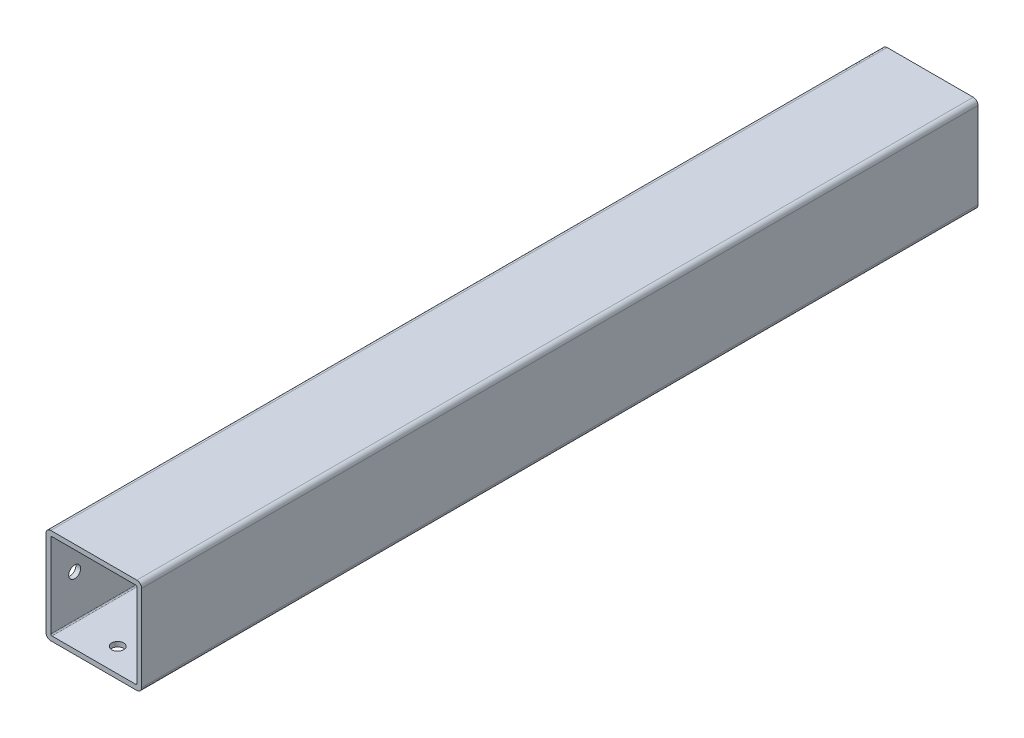
ISO-10303-21;
HEADER;
FILE_DESCRIPTION(('STEP AP214'),'2;1');
FILE_NAME('part.step','',(''),(''),'','','');
FILE_SCHEMA(('AUTOMOTIVE_DESIGN { 1 0 10303 214 1 1 1 1 }'));
ENDSEC;
DATA;
#1=APPLICATION_CONTEXT('core data for automotive mechanical design processes');
#2=APPLICATION_PROTOCOL_DEFINITION('international standard','automotive_design',2000,#1);
#3=PRODUCT_CONTEXT('',#1,'mechanical');
#4=PRODUCT('Part','Part','',(#3));
#5=PRODUCT_RELATED_PRODUCT_CATEGORY('part','',(#4));
#6=PRODUCT_DEFINITION_FORMATION('','',#4);
#7=PRODUCT_DEFINITION_CONTEXT('part definition',#1,'design');
#8=PRODUCT_DEFINITION('design','',#6,#7);
#9=PRODUCT_DEFINITION_SHAPE('','',#8);
#10=(LENGTH_UNIT() NAMED_UNIT(*) SI_UNIT(.MILLI.,.METRE.));
#11=(NAMED_UNIT(*) PLANE_ANGLE_UNIT() SI_UNIT($,.RADIAN.));
#12=(NAMED_UNIT(*) SI_UNIT($,.STERADIAN.) SOLID_ANGLE_UNIT());
#13=UNCERTAINTY_MEASURE_WITH_UNIT(LENGTH_MEASURE(1.E-05),#10,'distance_accuracy_value','');
#14=(GEOMETRIC_REPRESENTATION_CONTEXT(3) GLOBAL_UNCERTAINTY_ASSIGNED_CONTEXT((#13)) GLOBAL_UNIT_ASSIGNED_CONTEXT((#10,
#11,#12)) REPRESENTATION_CONTEXT('',''));
#15=CARTESIAN_POINT('',(0.,0.,0.));
#16=DIRECTION('',(0.,0.,1.));
#17=DIRECTION('',(1.,0.,0.));
#18=AXIS2_PLACEMENT_3D('',#15,#16,#17);
#19=CARTESIAN_POINT('',(0.,0.,350.));
#20=DIRECTION('',(0.,0.,1.));
#21=DIRECTION('',(1.,0.,0.));
#22=AXIS2_PLACEMENT_3D('',#19,#20,#21);
#23=PLANE('',#22);
#24=DIRECTION('',(1.,0.,0.));
#25=VECTOR('',#24,1.);
#26=CARTESIAN_POINT('',(-20.,-20.,350.));
#27=LINE('',#26,#25);
#28=CARTESIAN_POINT('',(-18.,-20.,350.));
#29=VERTEX_POINT('',#28);
#30=CARTESIAN_POINT('',(18.,-20.,350.));
#31=VERTEX_POINT('',#30);
#32=EDGE_CURVE('E209',#29,#31,#27,.T.);
#33=ORIENTED_EDGE('',*,*,#32,.T.);
#34=CARTESIAN_POINT('',(18.,-18.,350.));
#35=DIRECTION('',(0.,0.,1.));
#36=DIRECTION('',(1.,0.,0.));
#37=AXIS2_PLACEMENT_3D('',#34,#35,#36);
#38=CIRCLE('',#37,2.);
#39=CARTESIAN_POINT('',(20.,-18.,350.));
#40=VERTEX_POINT('',#39);
#41=EDGE_CURVE('E294',#31,#40,#38,.T.);
#42=ORIENTED_EDGE('',*,*,#41,.T.);
#43=DIRECTION('',(0.,1.,0.));
#44=VECTOR('',#43,1.);
#45=CARTESIAN_POINT('',(20.,20.,350.));
#46=LINE('',#45,#44);
#47=CARTESIAN_POINT('',(20.,18.,350.));
#48=VERTEX_POINT('',#47);
#49=EDGE_CURVE('E361',#40,#48,#46,.T.);
#50=ORIENTED_EDGE('',*,*,#49,.T.);
#51=CARTESIAN_POINT('',(18.,18.,350.));
#52=DIRECTION('',(0.,0.,1.));
#53=DIRECTION('',(1.,0.,0.));
#54=AXIS2_PLACEMENT_3D('',#51,#52,#53);
#55=CIRCLE('',#54,2.);
#56=CARTESIAN_POINT('',(18.,20.,350.));
#57=VERTEX_POINT('',#56);
#58=EDGE_CURVE('E288',#48,#57,#55,.T.);
#59=ORIENTED_EDGE('',*,*,#58,.T.);
#60=DIRECTION('',(-1.,0.,0.));
#61=VECTOR('',#60,1.);
#62=CARTESIAN_POINT('',(-20.,20.,350.));
#63=LINE('',#62,#61);
#64=CARTESIAN_POINT('',(-18.,20.,350.));
#65=VERTEX_POINT('',#64);
#66=EDGE_CURVE('E365',#57,#65,#63,.T.);
#67=ORIENTED_EDGE('',*,*,#66,.T.);
#68=CARTESIAN_POINT('',(-18.,18.,350.));
#69=DIRECTION('',(0.,0.,1.));
#70=DIRECTION('',(1.,0.,0.));
#71=AXIS2_PLACEMENT_3D('',#68,#69,#70);
#72=CIRCLE('',#71,2.);
#73=CARTESIAN_POINT('',(-20.,18.,350.));
#74=VERTEX_POINT('',#73);
#75=EDGE_CURVE('E87',#65,#74,#72,.T.);
#76=ORIENTED_EDGE('',*,*,#75,.T.);
#77=DIRECTION('',(0.,-1.,0.));
#78=VECTOR('',#77,1.);
#79=CARTESIAN_POINT('',(-20.,20.,350.));
#80=LINE('',#79,#78);
#81=CARTESIAN_POINT('',(-20.,-18.,350.));
#82=VERTEX_POINT('',#81);
#83=EDGE_CURVE('E218',#74,#82,#80,.T.);
#84=ORIENTED_EDGE('',*,*,#83,.T.);
#85=CARTESIAN_POINT('',(-18.,-18.,350.));
#86=DIRECTION('',(0.,0.,1.));
#87=DIRECTION('',(1.,0.,0.));
#88=AXIS2_PLACEMENT_3D('',#85,#86,#87);
#89=CIRCLE('',#88,2.);
#90=EDGE_CURVE('E291',#82,#29,#89,.T.);
#91=ORIENTED_EDGE('',*,*,#90,.T.);
#92=EDGE_LOOP('',(#33,#42,#50,#59,#67,#76,#84,#91));
#93=FACE_BOUND('',#92,.T.);
#94=DIRECTION('',(-1.,0.,0.));
#95=VECTOR('',#94,1.);
#96=CARTESIAN_POINT('',(-20.,18.,350.));
#97=LINE('',#96,#95);
#98=CARTESIAN_POINT('',(17.5,18.,350.));
#99=VERTEX_POINT('',#98);
#100=CARTESIAN_POINT('',(-17.5,18.,350.));
#101=VERTEX_POINT('',#100);
#102=EDGE_CURVE('E342',#99,#101,#97,.T.);
#103=ORIENTED_EDGE('',*,*,#102,.F.);
#104=CARTESIAN_POINT('',(17.5,17.5,350.));
#105=DIRECTION('',(0.,0.,1.));
#106=DIRECTION('',(1.,0.,0.));
#107=AXIS2_PLACEMENT_3D('',#104,#105,#106);
#108=CIRCLE('',#107,0.5);
#109=CARTESIAN_POINT('',(18.,17.5,350.));
#110=VERTEX_POINT('',#109);
#111=EDGE_CURVE('E253',#99,#110,#108,.F.);
#112=ORIENTED_EDGE('',*,*,#111,.T.);
#113=DIRECTION('',(0.,1.,0.));
#114=VECTOR('',#113,1.);
#115=CARTESIAN_POINT('',(18.,20.,350.));
#116=LINE('',#115,#114);
#117=CARTESIAN_POINT('',(18.,-17.5,350.));
#118=VERTEX_POINT('',#117);
#119=EDGE_CURVE('E338',#118,#110,#116,.T.);
#120=ORIENTED_EDGE('',*,*,#119,.F.);
#121=CARTESIAN_POINT('',(17.5,-17.5,350.));
#122=DIRECTION('',(0.,0.,1.));
#123=DIRECTION('',(1.,0.,0.));
#124=AXIS2_PLACEMENT_3D('',#121,#122,#123);
#125=CIRCLE('',#124,0.5);
#126=CARTESIAN_POINT('',(17.5,-18.,350.));
#127=VERTEX_POINT('',#126);
#128=EDGE_CURVE('E259',#118,#127,#125,.F.);
#129=ORIENTED_EDGE('',*,*,#128,.T.);
#130=DIRECTION('',(1.,0.,0.));
#131=VECTOR('',#130,1.);
#132=CARTESIAN_POINT('',(-20.,-18.,350.));
#133=LINE('',#132,#131);
#134=CARTESIAN_POINT('',(-17.5,-18.,350.));
#135=VERTEX_POINT('',#134);
#136=EDGE_CURVE('E349',#135,#127,#133,.T.);
#137=ORIENTED_EDGE('',*,*,#136,.F.);
#138=CARTESIAN_POINT('',(-17.5,-17.5,350.));
#139=DIRECTION('',(0.,0.,1.));
#140=DIRECTION('',(1.,0.,0.));
#141=AXIS2_PLACEMENT_3D('',#138,#139,#140);
#142=CIRCLE('',#141,0.5);
#143=CARTESIAN_POINT('',(-18.,-17.5,350.));
#144=VERTEX_POINT('',#143);
#145=EDGE_CURVE('E193',#135,#144,#142,.F.);
#146=ORIENTED_EDGE('',*,*,#145,.T.);
#147=DIRECTION('',(0.,-1.,0.));
#148=VECTOR('',#147,1.);
#149=CARTESIAN_POINT('',(-18.,20.,350.));
#150=LINE('',#149,#148);
#151=CARTESIAN_POINT('',(-18.,17.5,350.));
#152=VERTEX_POINT('',#151);
#153=EDGE_CURVE('E346',#152,#144,#150,.T.);
#154=ORIENTED_EDGE('',*,*,#153,.F.);
#155=CARTESIAN_POINT('',(-17.5,17.5,350.));
#156=DIRECTION('',(0.,0.,1.));
#157=DIRECTION('',(1.,0.,0.));
#158=AXIS2_PLACEMENT_3D('',#155,#156,#157);
#159=CIRCLE('',#158,0.5);
#160=EDGE_CURVE('E192',#152,#101,#159,.F.);
#161=ORIENTED_EDGE('',*,*,#160,.T.);
#162=EDGE_LOOP('',(#103,#112,#120,#129,#137,#146,#154,#161));
#163=FACE_BOUND('',#162,.T.);
#164=ADVANCED_FACE('F62',(#93,#163),#23,.T.);
#165=CARTESIAN_POINT('',(0.,0.,0.));
#166=DIRECTION('',(0.,0.,1.));
#167=DIRECTION('',(1.,0.,0.));
#168=AXIS2_PLACEMENT_3D('',#165,#166,#167);
#169=PLANE('',#168);
#170=DIRECTION('',(0.,1.,0.));
#171=VECTOR('',#170,1.);
#172=CARTESIAN_POINT('',(20.,20.,0.));
#173=LINE('',#172,#171);
#174=CARTESIAN_POINT('',(20.,-18.,0.));
#175=VERTEX_POINT('',#174);
#176=CARTESIAN_POINT('',(20.,18.,0.));
#177=VERTEX_POINT('',#176);
#178=EDGE_CURVE('E353',#175,#177,#173,.T.);
#179=ORIENTED_EDGE('',*,*,#178,.F.);
#180=CARTESIAN_POINT('',(18.,-18.,0.));
#181=DIRECTION('',(0.,0.,1.));
#182=DIRECTION('',(1.,0.,0.));
#183=AXIS2_PLACEMENT_3D('',#180,#181,#182);
#184=CIRCLE('',#183,2.);
#185=CARTESIAN_POINT('',(18.,-20.,0.));
#186=VERTEX_POINT('',#185);
#187=EDGE_CURVE('E276',#175,#186,#184,.F.);
#188=ORIENTED_EDGE('',*,*,#187,.T.);
#189=DIRECTION('',(1.,0.,0.));
#190=VECTOR('',#189,1.);
#191=CARTESIAN_POINT('',(-20.,-20.,0.));
#192=LINE('',#191,#190);
#193=CARTESIAN_POINT('',(-18.,-20.,0.));
#194=VERTEX_POINT('',#193);
#195=EDGE_CURVE('E221',#194,#186,#192,.T.);
#196=ORIENTED_EDGE('',*,*,#195,.F.);
#197=CARTESIAN_POINT('',(-18.,-18.,0.));
#198=DIRECTION('',(0.,0.,1.));
#199=DIRECTION('',(1.,0.,0.));
#200=AXIS2_PLACEMENT_3D('',#197,#198,#199);
#201=CIRCLE('',#200,2.);
#202=CARTESIAN_POINT('',(-20.,-18.,0.));
#203=VERTEX_POINT('',#202);
#204=EDGE_CURVE('E273',#194,#203,#201,.F.);
#205=ORIENTED_EDGE('',*,*,#204,.T.);
#206=DIRECTION('',(0.,-1.,0.));
#207=VECTOR('',#206,1.);
#208=CARTESIAN_POINT('',(-20.,20.,0.));
#209=LINE('',#208,#207);
#210=CARTESIAN_POINT('',(-20.,18.,0.));
#211=VERTEX_POINT('',#210);
#212=EDGE_CURVE('E375',#211,#203,#209,.T.);
#213=ORIENTED_EDGE('',*,*,#212,.F.);
#214=CARTESIAN_POINT('',(-18.,18.,0.));
#215=DIRECTION('',(0.,0.,1.));
#216=DIRECTION('',(1.,0.,0.));
#217=AXIS2_PLACEMENT_3D('',#214,#215,#216);
#218=CIRCLE('',#217,2.);
#219=CARTESIAN_POINT('',(-18.,20.,0.));
#220=VERTEX_POINT('',#219);
#221=EDGE_CURVE('E267',#211,#220,#218,.F.);
#222=ORIENTED_EDGE('',*,*,#221,.T.);
#223=DIRECTION('',(-1.,0.,0.));
#224=VECTOR('',#223,1.);
#225=CARTESIAN_POINT('',(-20.,20.,0.));
#226=LINE('',#225,#224);
#227=CARTESIAN_POINT('',(18.,20.,0.));
#228=VERTEX_POINT('',#227);
#229=EDGE_CURVE('E372',#228,#220,#226,.T.);
#230=ORIENTED_EDGE('',*,*,#229,.F.);
#231=CARTESIAN_POINT('',(18.,18.,0.));
#232=DIRECTION('',(0.,0.,1.));
#233=DIRECTION('',(1.,0.,0.));
#234=AXIS2_PLACEMENT_3D('',#231,#232,#233);
#235=CIRCLE('',#234,2.);
#236=EDGE_CURVE('E270',#228,#177,#235,.F.);
#237=ORIENTED_EDGE('',*,*,#236,.T.);
#238=EDGE_LOOP('',(#179,#188,#196,#205,#213,#222,#230,#237));
#239=FACE_BOUND('',#238,.T.);
#240=DIRECTION('',(1.,0.,0.));
#241=VECTOR('',#240,1.);
#242=CARTESIAN_POINT('',(-20.,-18.,0.));
#243=LINE('',#242,#241);
#244=CARTESIAN_POINT('',(-17.5,-18.,0.));
#245=VERTEX_POINT('',#244);
#246=CARTESIAN_POINT('',(17.5,-18.,0.));
#247=VERTEX_POINT('',#246);
#248=EDGE_CURVE('E204',#245,#247,#243,.T.);
#249=ORIENTED_EDGE('',*,*,#248,.T.);
#250=CARTESIAN_POINT('',(17.5,-17.5,0.));
#251=DIRECTION('',(0.,0.,1.));
#252=DIRECTION('',(1.,0.,0.));
#253=AXIS2_PLACEMENT_3D('',#250,#251,#252);
#254=CIRCLE('',#253,0.5);
#255=CARTESIAN_POINT('',(18.,-17.5,0.));
#256=VERTEX_POINT('',#255);
#257=EDGE_CURVE('E256',#247,#256,#254,.T.);
#258=ORIENTED_EDGE('',*,*,#257,.T.);
#259=DIRECTION('',(0.,1.,0.));
#260=VECTOR('',#259,1.);
#261=CARTESIAN_POINT('',(18.,20.,0.));
#262=LINE('',#261,#260);
#263=CARTESIAN_POINT('',(18.,17.5,0.));
#264=VERTEX_POINT('',#263);
#265=EDGE_CURVE('E309',#256,#264,#262,.T.);
#266=ORIENTED_EDGE('',*,*,#265,.T.);
#267=CARTESIAN_POINT('',(17.5,17.5,0.));
#268=DIRECTION('',(0.,0.,1.));
#269=DIRECTION('',(1.,0.,0.));
#270=AXIS2_PLACEMENT_3D('',#267,#268,#269);
#271=CIRCLE('',#270,0.5);
#272=CARTESIAN_POINT('',(17.5,18.,0.));
#273=VERTEX_POINT('',#272);
#274=EDGE_CURVE('E250',#264,#273,#271,.T.);
#275=ORIENTED_EDGE('',*,*,#274,.T.);
#276=DIRECTION('',(-1.,0.,0.));
#277=VECTOR('',#276,1.);
#278=CARTESIAN_POINT('',(-20.,18.,0.));
#279=LINE('',#278,#277);
#280=CARTESIAN_POINT('',(-17.5,18.,0.));
#281=VERTEX_POINT('',#280);
#282=EDGE_CURVE('E186',#273,#281,#279,.T.);
#283=ORIENTED_EDGE('',*,*,#282,.T.);
#284=CARTESIAN_POINT('',(-17.5,17.5,0.));
#285=DIRECTION('',(0.,0.,1.));
#286=DIRECTION('',(1.,0.,0.));
#287=AXIS2_PLACEMENT_3D('',#284,#285,#286);
#288=CIRCLE('',#287,0.5);
#289=CARTESIAN_POINT('',(-18.,17.5,0.));
#290=VERTEX_POINT('',#289);
#291=EDGE_CURVE('E180',#281,#290,#288,.T.);
#292=ORIENTED_EDGE('',*,*,#291,.T.);
#293=DIRECTION('',(0.,-1.,0.));
#294=VECTOR('',#293,1.);
#295=CARTESIAN_POINT('',(-18.,20.,0.));
#296=LINE('',#295,#294);
#297=CARTESIAN_POINT('',(-18.,-17.5,0.));
#298=VERTEX_POINT('',#297);
#299=EDGE_CURVE('E184',#290,#298,#296,.T.);
#300=ORIENTED_EDGE('',*,*,#299,.T.);
#301=CARTESIAN_POINT('',(-17.5,-17.5,0.));
#302=DIRECTION('',(0.,0.,1.));
#303=DIRECTION('',(1.,0.,0.));
#304=AXIS2_PLACEMENT_3D('',#301,#302,#303);
#305=CIRCLE('',#304,0.5);
#306=EDGE_CURVE('E243',#298,#245,#305,.T.);
#307=ORIENTED_EDGE('',*,*,#306,.T.);
#308=EDGE_LOOP('',(#249,#258,#266,#275,#283,#292,#300,#307));
#309=FACE_BOUND('',#308,.T.);
#310=ADVANCED_FACE('F183',(#239,#309),#169,.F.);
#311=CARTESIAN_POINT('',(20.,20.,350.));
#312=DIRECTION('',(-1.,0.,0.));
#313=DIRECTION('',(0.,-1.,0.));
#314=AXIS2_PLACEMENT_3D('',#311,#312,#313);
#315=PLANE('',#314);
#316=ORIENTED_EDGE('',*,*,#49,.F.);
#317=DIRECTION('',(0.,0.,-1.));
#318=VECTOR('',#317,1.);
#319=CARTESIAN_POINT('',(20.,-18.,350.));
#320=LINE('',#319,#318);
#321=EDGE_CURVE('E264',#40,#175,#320,.T.);
#322=ORIENTED_EDGE('',*,*,#321,.T.);
#323=ORIENTED_EDGE('',*,*,#178,.T.);
#324=DIRECTION('',(0.,0.,-1.));
#325=VECTOR('',#324,1.);
#326=CARTESIAN_POINT('',(20.,18.,350.));
#327=LINE('',#326,#325);
#328=EDGE_CURVE('E261',#177,#48,#327,.F.);
#329=ORIENTED_EDGE('',*,*,#328,.T.);
#330=EDGE_LOOP('',(#316,#322,#323,#329));
#331=FACE_BOUND('',#330,.T.);
#332=ADVANCED_FACE('F395',(#331),#315,.F.);
#333=CARTESIAN_POINT('',(-20.,20.,350.));
#334=DIRECTION('',(0.,-1.,0.));
#335=DIRECTION('',(0.,0.,-1.));
#336=AXIS2_PLACEMENT_3D('',#333,#334,#335);
#337=PLANE('',#336);
#338=ORIENTED_EDGE('',*,*,#66,.F.);
#339=DIRECTION('',(0.,0.,-1.));
#340=VECTOR('',#339,1.);
#341=CARTESIAN_POINT('',(18.,20.,350.));
#342=LINE('',#341,#340);
#343=EDGE_CURVE('E12',#57,#228,#342,.T.);
#344=ORIENTED_EDGE('',*,*,#343,.T.);
#345=ORIENTED_EDGE('',*,*,#229,.T.);
#346=DIRECTION('',(0.,0.,-1.));
#347=VECTOR('',#346,1.);
#348=CARTESIAN_POINT('',(-18.,20.,350.));
#349=LINE('',#348,#347);
#350=EDGE_CURVE('E72',#220,#65,#349,.F.);
#351=ORIENTED_EDGE('',*,*,#350,.T.);
#352=EDGE_LOOP('',(#338,#344,#345,#351));
#353=FACE_BOUND('',#352,.T.);
#354=ADVANCED_FACE('F403',(#353),#337,.F.);
#355=CARTESIAN_POINT('',(-20.,20.,350.));
#356=DIRECTION('',(1.,0.,0.));
#357=DIRECTION('',(0.,1.,0.));
#358=AXIS2_PLACEMENT_3D('',#355,#356,#357);
#359=PLANE('',#358);
#360=CARTESIAN_POINT('',(-20.,0.,315.));
#361=DIRECTION('',(1.,0.,0.));
#362=DIRECTION('',(0.,0.,-1.));
#363=AXIS2_PLACEMENT_3D('',#360,#361,#362);
#364=CIRCLE('',#363,2.50000000000002);
#365=CARTESIAN_POINT('',(-20.,0.,312.5));
#366=VERTEX_POINT('',#365);
#367=EDGE_CURVE('E314',#366,#366,#364,.T.);
#368=ORIENTED_EDGE('',*,*,#367,.T.);
#369=EDGE_LOOP('',(#368));
#370=FACE_BOUND('',#369,.T.);
#371=CARTESIAN_POINT('',(-20.,0.,340.));
#372=DIRECTION('',(1.,0.,0.));
#373=DIRECTION('',(0.,0.,-1.));
#374=AXIS2_PLACEMENT_3D('',#371,#372,#373);
#375=CIRCLE('',#374,2.50000000000002);
#376=CARTESIAN_POINT('',(-20.,0.,337.5));
#377=VERTEX_POINT('',#376);
#378=EDGE_CURVE('E310',#377,#377,#375,.T.);
#379=ORIENTED_EDGE('',*,*,#378,.T.);
#380=EDGE_LOOP('',(#379));
#381=FACE_BOUND('',#380,.T.);
#382=ORIENTED_EDGE('',*,*,#212,.T.);
#383=DIRECTION('',(0.,0.,-1.));
#384=VECTOR('',#383,1.);
#385=CARTESIAN_POINT('',(-20.,-18.,350.));
#386=LINE('',#385,#384);
#387=EDGE_CURVE('E80',#203,#82,#386,.F.);
#388=ORIENTED_EDGE('',*,*,#387,.T.);
#389=ORIENTED_EDGE('',*,*,#83,.F.);
#390=DIRECTION('',(0.,0.,-1.));
#391=VECTOR('',#390,1.);
#392=CARTESIAN_POINT('',(-20.,18.,350.));
#393=LINE('',#392,#391);
#394=EDGE_CURVE('E297',#74,#211,#393,.T.);
#395=ORIENTED_EDGE('',*,*,#394,.T.);
#396=EDGE_LOOP('',(#382,#388,#389,#395));
#397=FACE_BOUND('',#396,.T.);
#398=ADVANCED_FACE('F408',(#370,#381,#397),#359,.F.);
#399=CARTESIAN_POINT('',(-20.,-20.,350.));
#400=DIRECTION('',(0.,1.,0.));
#401=DIRECTION('',(0.,0.,1.));
#402=AXIS2_PLACEMENT_3D('',#399,#400,#401);
#403=PLANE('',#402);
#404=CARTESIAN_POINT('',(0.,-20.0000000000001,315.));
#405=DIRECTION('',(0.,1.,0.));
#406=DIRECTION('',(0.,0.,-1.));
#407=AXIS2_PLACEMENT_3D('',#404,#405,#406);
#408=CIRCLE('',#407,2.50000000000002);
#409=CARTESIAN_POINT('',(0.,-20.0000000000001,312.5));
#410=VERTEX_POINT('',#409);
#411=EDGE_CURVE('E332',#410,#410,#408,.T.);
#412=ORIENTED_EDGE('',*,*,#411,.T.);
#413=EDGE_LOOP('',(#412));
#414=FACE_BOUND('',#413,.T.);
#415=CARTESIAN_POINT('',(0.,-20.0000000000001,340.));
#416=DIRECTION('',(0.,1.,0.));
#417=DIRECTION('',(0.,0.,-1.));
#418=AXIS2_PLACEMENT_3D('',#415,#416,#417);
#419=CIRCLE('',#418,2.50000000000002);
#420=CARTESIAN_POINT('',(0.,-20.0000000000001,337.5));
#421=VERTEX_POINT('',#420);
#422=EDGE_CURVE('E318',#421,#421,#419,.T.);
#423=ORIENTED_EDGE('',*,*,#422,.T.);
#424=EDGE_LOOP('',(#423));
#425=FACE_BOUND('',#424,.T.);
#426=ORIENTED_EDGE('',*,*,#195,.T.);
#427=DIRECTION('',(0.,0.,-1.));
#428=VECTOR('',#427,1.);
#429=CARTESIAN_POINT('',(18.,-20.,350.));
#430=LINE('',#429,#428);
#431=EDGE_CURVE('E283',#186,#31,#430,.F.);
#432=ORIENTED_EDGE('',*,*,#431,.T.);
#433=ORIENTED_EDGE('',*,*,#32,.F.);
#434=DIRECTION('',(0.,0.,-1.));
#435=VECTOR('',#434,1.);
#436=CARTESIAN_POINT('',(-18.,-20.,350.));
#437=LINE('',#436,#435);
#438=EDGE_CURVE('E279',#29,#194,#437,.T.);
#439=ORIENTED_EDGE('',*,*,#438,.T.);
#440=EDGE_LOOP('',(#426,#432,#433,#439));
#441=FACE_BOUND('',#440,.T.);
#442=ADVANCED_FACE('F383',(#414,#425,#441),#403,.F.);
#443=CARTESIAN_POINT('',(18.,20.,350.));
#444=DIRECTION('',(-1.,0.,0.));
#445=DIRECTION('',(0.,-1.,0.));
#446=AXIS2_PLACEMENT_3D('',#443,#444,#445);
#447=PLANE('',#446);
#448=ORIENTED_EDGE('',*,*,#119,.T.);
#449=DIRECTION('',(0.,0.,-1.));
#450=VECTOR('',#449,1.);
#451=CARTESIAN_POINT('',(18.,17.5,0.));
#452=LINE('',#451,#450);
#453=EDGE_CURVE('E239',#110,#264,#452,.T.);
#454=ORIENTED_EDGE('',*,*,#453,.T.);
#455=ORIENTED_EDGE('',*,*,#265,.F.);
#456=DIRECTION('',(0.,0.,-1.));
#457=VECTOR('',#456,1.);
#458=CARTESIAN_POINT('',(18.,-17.5,350.));
#459=LINE('',#458,#457);
#460=EDGE_CURVE('E236',#256,#118,#459,.F.);
#461=ORIENTED_EDGE('',*,*,#460,.T.);
#462=EDGE_LOOP('',(#448,#454,#455,#461));
#463=FACE_BOUND('',#462,.T.);
#464=ADVANCED_FACE('F427',(#463),#447,.T.);
#465=CARTESIAN_POINT('',(-20.,18.,350.));
#466=DIRECTION('',(0.,-1.,0.));
#467=DIRECTION('',(0.,0.,-1.));
#468=AXIS2_PLACEMENT_3D('',#465,#466,#467);
#469=PLANE('',#468);
#470=ORIENTED_EDGE('',*,*,#102,.T.);
#471=DIRECTION('',(0.,0.,-1.));
#472=VECTOR('',#471,1.);
#473=CARTESIAN_POINT('',(-17.5,18.,0.));
#474=LINE('',#473,#472);
#475=EDGE_CURVE('E233',#101,#281,#474,.T.);
#476=ORIENTED_EDGE('',*,*,#475,.T.);
#477=ORIENTED_EDGE('',*,*,#282,.F.);
#478=DIRECTION('',(0.,0.,-1.));
#479=VECTOR('',#478,1.);
#480=CARTESIAN_POINT('',(17.5,18.,350.));
#481=LINE('',#480,#479);
#482=EDGE_CURVE('E230',#273,#99,#481,.F.);
#483=ORIENTED_EDGE('',*,*,#482,.T.);
#484=EDGE_LOOP('',(#470,#476,#477,#483));
#485=FACE_BOUND('',#484,.T.);
#486=ADVANCED_FACE('F467',(#485),#469,.T.);
#487=CARTESIAN_POINT('',(-18.,20.,350.));
#488=DIRECTION('',(1.,0.,0.));
#489=DIRECTION('',(0.,1.,0.));
#490=AXIS2_PLACEMENT_3D('',#487,#488,#489);
#491=PLANE('',#490);
#492=CARTESIAN_POINT('',(-18.,0.,315.));
#493=DIRECTION('',(1.,0.,0.));
#494=DIRECTION('',(0.,1.,0.));
#495=AXIS2_PLACEMENT_3D('',#492,#493,#494);
#496=CIRCLE('',#495,2.50000000000002);
#497=CARTESIAN_POINT('',(-18.,2.50000000000002,315.));
#498=VERTEX_POINT('',#497);
#499=EDGE_CURVE('E311',#498,#498,#496,.T.);
#500=ORIENTED_EDGE('',*,*,#499,.F.);
#501=EDGE_LOOP('',(#500));
#502=FACE_BOUND('',#501,.T.);
#503=CARTESIAN_POINT('',(-18.,0.,340.));
#504=DIRECTION('',(1.,0.,0.));
#505=DIRECTION('',(0.,1.,0.));
#506=AXIS2_PLACEMENT_3D('',#503,#504,#505);
#507=CIRCLE('',#506,2.50000000000002);
#508=CARTESIAN_POINT('',(-18.,2.50000000000002,340.));
#509=VERTEX_POINT('',#508);
#510=EDGE_CURVE('E305',#509,#509,#507,.T.);
#511=ORIENTED_EDGE('',*,*,#510,.F.);
#512=EDGE_LOOP('',(#511));
#513=FACE_BOUND('',#512,.T.);
#514=ORIENTED_EDGE('',*,*,#153,.T.);
#515=DIRECTION('',(0.,0.,-1.));
#516=VECTOR('',#515,1.);
#517=CARTESIAN_POINT('',(-18.,-17.5,0.));
#518=LINE('',#517,#516);
#519=EDGE_CURVE('E202',#144,#298,#518,.T.);
#520=ORIENTED_EDGE('',*,*,#519,.T.);
#521=ORIENTED_EDGE('',*,*,#299,.F.);
#522=DIRECTION('',(0.,0.,-1.));
#523=VECTOR('',#522,1.);
#524=CARTESIAN_POINT('',(-18.,17.5,350.));
#525=LINE('',#524,#523);
#526=EDGE_CURVE('E199',#290,#152,#525,.F.);
#527=ORIENTED_EDGE('',*,*,#526,.T.);
#528=EDGE_LOOP('',(#514,#520,#521,#527));
#529=FACE_BOUND('',#528,.T.);
#530=ADVANCED_FACE('F198',(#502,#513,#529),#491,.T.);
#531=CARTESIAN_POINT('',(-20.,-18.,350.));
#532=DIRECTION('',(0.,1.,0.));
#533=DIRECTION('',(0.,0.,1.));
#534=AXIS2_PLACEMENT_3D('',#531,#532,#533);
#535=PLANE('',#534);
#536=CARTESIAN_POINT('',(0.,-18.,315.));
#537=DIRECTION('',(0.,1.,0.));
#538=DIRECTION('',(0.,0.,1.));
#539=AXIS2_PLACEMENT_3D('',#536,#537,#538);
#540=CIRCLE('',#539,2.50000000000002);
#541=CARTESIAN_POINT('',(0.,-18.,317.5));
#542=VERTEX_POINT('',#541);
#543=EDGE_CURVE('E66',#542,#542,#540,.T.);
#544=ORIENTED_EDGE('',*,*,#543,.F.);
#545=EDGE_LOOP('',(#544));
#546=FACE_BOUND('',#545,.T.);
#547=CARTESIAN_POINT('',(0.,-18.,340.));
#548=DIRECTION('',(0.,1.,0.));
#549=DIRECTION('',(0.,0.,1.));
#550=AXIS2_PLACEMENT_3D('',#547,#548,#549);
#551=CIRCLE('',#550,2.50000000000002);
#552=CARTESIAN_POINT('',(0.,-18.,342.5));
#553=VERTEX_POINT('',#552);
#554=EDGE_CURVE('E315',#553,#553,#551,.T.);
#555=ORIENTED_EDGE('',*,*,#554,.F.);
#556=EDGE_LOOP('',(#555));
#557=FACE_BOUND('',#556,.T.);
#558=ORIENTED_EDGE('',*,*,#248,.F.);
#559=DIRECTION('',(0.,0.,-1.));
#560=VECTOR('',#559,1.);
#561=CARTESIAN_POINT('',(-17.5,-18.,350.));
#562=LINE('',#561,#560);
#563=EDGE_CURVE('E227',#245,#135,#562,.F.);
#564=ORIENTED_EDGE('',*,*,#563,.T.);
#565=ORIENTED_EDGE('',*,*,#136,.T.);
#566=DIRECTION('',(0.,0.,-1.));
#567=VECTOR('',#566,1.);
#568=CARTESIAN_POINT('',(17.5,-18.,0.));
#569=LINE('',#568,#567);
#570=EDGE_CURVE('E214',#127,#247,#569,.T.);
#571=ORIENTED_EDGE('',*,*,#570,.T.);
#572=EDGE_LOOP('',(#558,#564,#565,#571));
#573=FACE_BOUND('',#572,.T.);
#574=ADVANCED_FACE('F443',(#546,#557,#573),#535,.T.);
#575=CARTESIAN_POINT('',(-17.5,-17.5,350.));
#576=DIRECTION('',(0.,0.,1.));
#577=DIRECTION('',(1.,0.,0.));
#578=AXIS2_PLACEMENT_3D('',#575,#576,#577);
#579=CYLINDRICAL_SURFACE('',#578,0.5);
#580=ORIENTED_EDGE('',*,*,#145,.F.);
#581=ORIENTED_EDGE('',*,*,#563,.F.);
#582=ORIENTED_EDGE('',*,*,#306,.F.);
#583=ORIENTED_EDGE('',*,*,#519,.F.);
#584=EDGE_LOOP('',(#580,#581,#582,#583));
#585=FACE_BOUND('',#584,.T.);
#586=ADVANCED_FACE('F440',(#585),#579,.F.);
#587=CARTESIAN_POINT('',(-17.5,17.5,350.));
#588=DIRECTION('',(0.,0.,1.));
#589=DIRECTION('',(1.,0.,0.));
#590=AXIS2_PLACEMENT_3D('',#587,#588,#589);
#591=CYLINDRICAL_SURFACE('',#590,0.5);
#592=ORIENTED_EDGE('',*,*,#160,.F.);
#593=ORIENTED_EDGE('',*,*,#526,.F.);
#594=ORIENTED_EDGE('',*,*,#291,.F.);
#595=ORIENTED_EDGE('',*,*,#475,.F.);
#596=EDGE_LOOP('',(#592,#593,#594,#595));
#597=FACE_BOUND('',#596,.T.);
#598=ADVANCED_FACE('F207',(#597),#591,.F.);
#599=CARTESIAN_POINT('',(17.5,17.5,350.));
#600=DIRECTION('',(0.,0.,1.));
#601=DIRECTION('',(1.,0.,0.));
#602=AXIS2_PLACEMENT_3D('',#599,#600,#601);
#603=CYLINDRICAL_SURFACE('',#602,0.5);
#604=ORIENTED_EDGE('',*,*,#111,.F.);
#605=ORIENTED_EDGE('',*,*,#482,.F.);
#606=ORIENTED_EDGE('',*,*,#274,.F.);
#607=ORIENTED_EDGE('',*,*,#453,.F.);
#608=EDGE_LOOP('',(#604,#605,#606,#607));
#609=FACE_BOUND('',#608,.T.);
#610=ADVANCED_FACE('F447',(#609),#603,.F.);
#611=CARTESIAN_POINT('',(17.5,-17.5,350.));
#612=DIRECTION('',(0.,0.,1.));
#613=DIRECTION('',(1.,0.,0.));
#614=AXIS2_PLACEMENT_3D('',#611,#612,#613);
#615=CYLINDRICAL_SURFACE('',#614,0.5);
#616=ORIENTED_EDGE('',*,*,#128,.F.);
#617=ORIENTED_EDGE('',*,*,#460,.F.);
#618=ORIENTED_EDGE('',*,*,#257,.F.);
#619=ORIENTED_EDGE('',*,*,#570,.F.);
#620=EDGE_LOOP('',(#616,#617,#618,#619));
#621=FACE_BOUND('',#620,.T.);
#622=ADVANCED_FACE('F418',(#621),#615,.F.);
#623=CARTESIAN_POINT('',(18.,-18.,350.));
#624=DIRECTION('',(0.,0.,-1.));
#625=DIRECTION('',(-1.,0.,0.));
#626=AXIS2_PLACEMENT_3D('',#623,#624,#625);
#627=CYLINDRICAL_SURFACE('',#626,2.);
#628=ORIENTED_EDGE('',*,*,#41,.F.);
#629=ORIENTED_EDGE('',*,*,#431,.F.);
#630=ORIENTED_EDGE('',*,*,#187,.F.);
#631=ORIENTED_EDGE('',*,*,#321,.F.);
#632=EDGE_LOOP('',(#628,#629,#630,#631));
#633=FACE_BOUND('',#632,.T.);
#634=ADVANCED_FACE('F389',(#633),#627,.T.);
#635=CARTESIAN_POINT('',(-18.,-18.,350.));
#636=DIRECTION('',(0.,0.,-1.));
#637=DIRECTION('',(-1.,0.,0.));
#638=AXIS2_PLACEMENT_3D('',#635,#636,#637);
#639=CYLINDRICAL_SURFACE('',#638,2.);
#640=ORIENTED_EDGE('',*,*,#90,.F.);
#641=ORIENTED_EDGE('',*,*,#387,.F.);
#642=ORIENTED_EDGE('',*,*,#204,.F.);
#643=ORIENTED_EDGE('',*,*,#438,.F.);
#644=EDGE_LOOP('',(#640,#641,#642,#643));
#645=FACE_BOUND('',#644,.T.);
#646=ADVANCED_FACE('F411',(#645),#639,.T.);
#647=CARTESIAN_POINT('',(18.,18.,350.));
#648=DIRECTION('',(0.,0.,-1.));
#649=DIRECTION('',(-1.,0.,0.));
#650=AXIS2_PLACEMENT_3D('',#647,#648,#649);
#651=CYLINDRICAL_SURFACE('',#650,2.);
#652=ORIENTED_EDGE('',*,*,#58,.F.);
#653=ORIENTED_EDGE('',*,*,#328,.F.);
#654=ORIENTED_EDGE('',*,*,#236,.F.);
#655=ORIENTED_EDGE('',*,*,#343,.F.);
#656=EDGE_LOOP('',(#652,#653,#654,#655));
#657=FACE_BOUND('',#656,.T.);
#658=ADVANCED_FACE('F399',(#657),#651,.T.);
#659=CARTESIAN_POINT('',(-18.,18.,350.));
#660=DIRECTION('',(0.,0.,-1.));
#661=DIRECTION('',(-1.,0.,0.));
#662=AXIS2_PLACEMENT_3D('',#659,#660,#661);
#663=CYLINDRICAL_SURFACE('',#662,2.);
#664=ORIENTED_EDGE('',*,*,#75,.F.);
#665=ORIENTED_EDGE('',*,*,#350,.F.);
#666=ORIENTED_EDGE('',*,*,#221,.F.);
#667=ORIENTED_EDGE('',*,*,#394,.F.);
#668=EDGE_LOOP('',(#664,#665,#666,#667));
#669=FACE_BOUND('',#668,.T.);
#670=ADVANCED_FACE('F64',(#669),#663,.T.);
#671=CARTESIAN_POINT('',(-20.,0.,340.));
#672=DIRECTION('',(1.,0.,0.));
#673=DIRECTION('',(0.,0.,-1.));
#674=AXIS2_PLACEMENT_3D('',#671,#672,#673);
#675=CYLINDRICAL_SURFACE('',#674,2.50000000000002);
#676=ORIENTED_EDGE('',*,*,#510,.T.);
#677=EDGE_LOOP('',(#676));
#678=FACE_BOUND('',#677,.T.);
#679=ORIENTED_EDGE('',*,*,#378,.F.);
#680=EDGE_LOOP('',(#679));
#681=FACE_BOUND('',#680,.T.);
#682=ADVANCED_FACE('F485',(#678,#681),#675,.F.);
#683=CARTESIAN_POINT('',(-20.,0.,315.));
#684=DIRECTION('',(1.,0.,0.));
#685=DIRECTION('',(0.,0.,-1.));
#686=AXIS2_PLACEMENT_3D('',#683,#684,#685);
#687=CYLINDRICAL_SURFACE('',#686,2.50000000000002);
#688=ORIENTED_EDGE('',*,*,#499,.T.);
#689=EDGE_LOOP('',(#688));
#690=FACE_BOUND('',#689,.T.);
#691=ORIENTED_EDGE('',*,*,#367,.F.);
#692=EDGE_LOOP('',(#691));
#693=FACE_BOUND('',#692,.T.);
#694=ADVANCED_FACE('F488',(#690,#693),#687,.F.);
#695=CARTESIAN_POINT('',(0.,-20.0000000000001,340.));
#696=DIRECTION('',(0.,1.,0.));
#697=DIRECTION('',(-1.,0.,0.));
#698=AXIS2_PLACEMENT_3D('',#695,#696,#697);
#699=CYLINDRICAL_SURFACE('',#698,2.50000000000002);
#700=ORIENTED_EDGE('',*,*,#554,.T.);
#701=EDGE_LOOP('',(#700));
#702=FACE_BOUND('',#701,.T.);
#703=ORIENTED_EDGE('',*,*,#422,.F.);
#704=EDGE_LOOP('',(#703));
#705=FACE_BOUND('',#704,.T.);
#706=ADVANCED_FACE('F492',(#702,#705),#699,.F.);
#707=CARTESIAN_POINT('',(0.,-20.0000000000001,315.));
#708=DIRECTION('',(0.,1.,0.));
#709=DIRECTION('',(-1.,0.,0.));
#710=AXIS2_PLACEMENT_3D('',#707,#708,#709);
#711=CYLINDRICAL_SURFACE('',#710,2.50000000000002);
#712=ORIENTED_EDGE('',*,*,#543,.T.);
#713=EDGE_LOOP('',(#712));
#714=FACE_BOUND('',#713,.T.);
#715=ORIENTED_EDGE('',*,*,#411,.F.);
#716=EDGE_LOOP('',(#715));
#717=FACE_BOUND('',#716,.T.);
#718=ADVANCED_FACE('F496',(#714,#717),#711,.F.);
#719=CLOSED_SHELL('',(#164,#310,#332,#354,#398,#442,#464,#486,#530,#574,#586,#598,#610,#622,
#634,#646,#658,#670,#682,#694,#706,#718));
#720=MANIFOLD_SOLID_BREP('B2',#719);
#721=ADVANCED_BREP_SHAPE_REPRESENTATION('',(#18,#720),#14);
#722=SHAPE_DEFINITION_REPRESENTATION(#9,#721);
ENDSEC;
END-ISO-10303-21;
